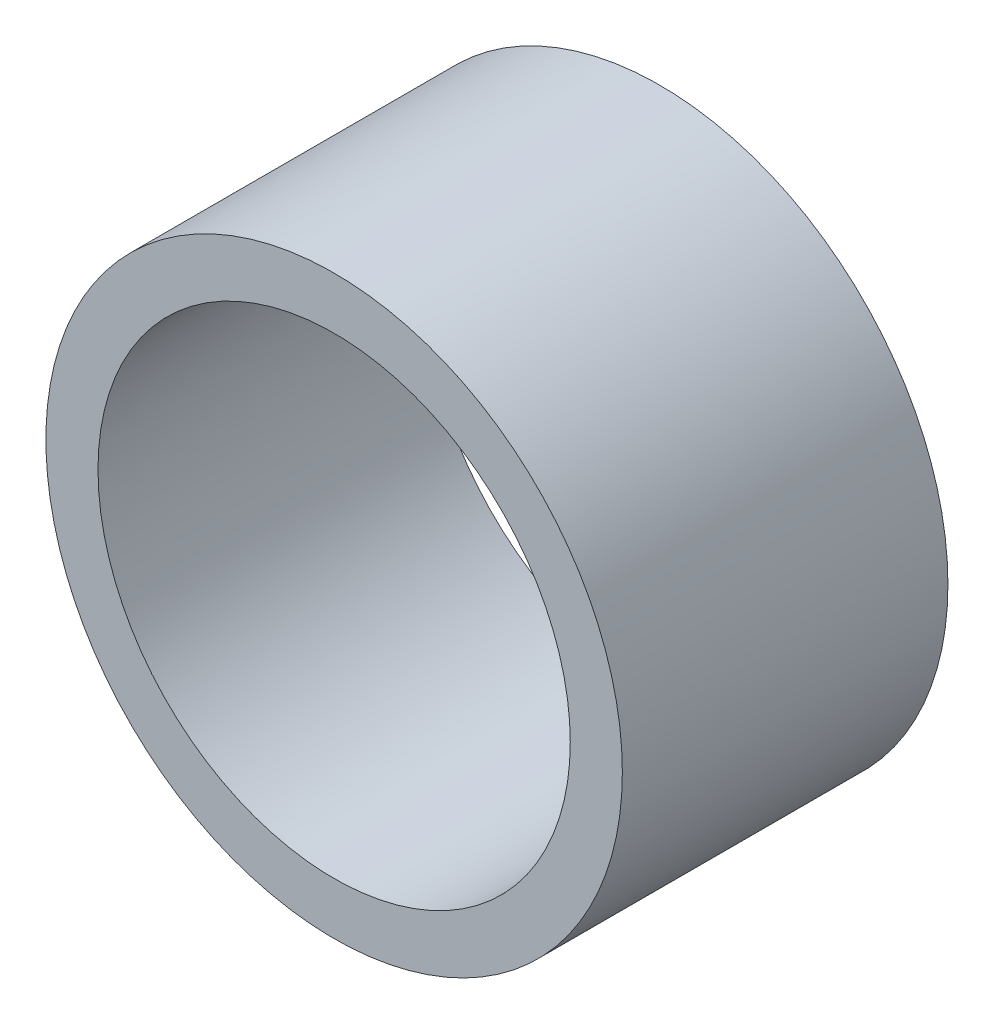
ISO-10303-21;
HEADER;
FILE_DESCRIPTION(('STEP AP214'),'2;1');
FILE_NAME('part.step','',(''),(''),'','','');
FILE_SCHEMA(('AUTOMOTIVE_DESIGN { 1 0 10303 214 1 1 1 1 }'));
ENDSEC;
DATA;
#1=APPLICATION_CONTEXT('core data for automotive mechanical design processes');
#2=APPLICATION_PROTOCOL_DEFINITION('international standard','automotive_design',2000,#1);
#3=PRODUCT_CONTEXT('',#1,'mechanical');
#4=PRODUCT('Part','Part','',(#3));
#5=PRODUCT_RELATED_PRODUCT_CATEGORY('part','',(#4));
#6=PRODUCT_DEFINITION_FORMATION('','',#4);
#7=PRODUCT_DEFINITION_CONTEXT('part definition',#1,'design');
#8=PRODUCT_DEFINITION('design','',#6,#7);
#9=PRODUCT_DEFINITION_SHAPE('','',#8);
#10=(LENGTH_UNIT() NAMED_UNIT(*) SI_UNIT(.MILLI.,.METRE.));
#11=(NAMED_UNIT(*) PLANE_ANGLE_UNIT() SI_UNIT($,.RADIAN.));
#12=(NAMED_UNIT(*) SI_UNIT($,.STERADIAN.) SOLID_ANGLE_UNIT());
#13=UNCERTAINTY_MEASURE_WITH_UNIT(LENGTH_MEASURE(1.E-05),#10,'distance_accuracy_value','');
#14=(GEOMETRIC_REPRESENTATION_CONTEXT(3) GLOBAL_UNCERTAINTY_ASSIGNED_CONTEXT((#13)) GLOBAL_UNIT_ASSIGNED_CONTEXT((#10,
#11,#12)) REPRESENTATION_CONTEXT('',''));
#15=CARTESIAN_POINT('',(0.,0.,0.));
#16=DIRECTION('',(0.,0.,1.));
#17=DIRECTION('',(1.,0.,0.));
#18=AXIS2_PLACEMENT_3D('',#15,#16,#17);
#19=CARTESIAN_POINT('',(0.,0.,23.8125));
#20=DIRECTION('',(0.,0.,-1.));
#21=DIRECTION('',(-1.,0.,0.));
#22=AXIS2_PLACEMENT_3D('',#19,#20,#21);
#23=CYLINDRICAL_SURFACE('',#22,17.272);
#24=CARTESIAN_POINT('',(0.,0.,23.8125));
#25=DIRECTION('',(0.,0.,1.));
#26=DIRECTION('',(1.,0.,0.));
#27=AXIS2_PLACEMENT_3D('',#24,#25,#26);
#28=CIRCLE('',#27,17.272);
#29=CARTESIAN_POINT('',(17.272,0.,23.8125));
#30=VERTEX_POINT('',#29);
#31=EDGE_CURVE('E42',#30,#30,#28,.T.);
#32=ORIENTED_EDGE('',*,*,#31,.T.);
#33=EDGE_LOOP('',(#32));
#34=FACE_BOUND('',#33,.T.);
#35=CARTESIAN_POINT('',(0.,0.,0.));
#36=DIRECTION('',(0.,0.,1.));
#37=DIRECTION('',(1.,0.,0.));
#38=AXIS2_PLACEMENT_3D('',#35,#36,#37);
#39=CIRCLE('',#38,17.272);
#40=CARTESIAN_POINT('',(17.272,0.,0.));
#41=VERTEX_POINT('',#40);
#42=EDGE_CURVE('E50',#41,#41,#39,.T.);
#43=ORIENTED_EDGE('',*,*,#42,.F.);
#44=EDGE_LOOP('',(#43));
#45=FACE_BOUND('',#44,.T.);
#46=ADVANCED_FACE('F34',(#34,#45),#23,.F.);
#47=CARTESIAN_POINT('',(0.,0.,23.8125));
#48=DIRECTION('',(0.,0.,-1.));
#49=DIRECTION('',(-1.,0.,0.));
#50=AXIS2_PLACEMENT_3D('',#47,#48,#49);
#51=CYLINDRICAL_SURFACE('',#50,21.082);
#52=CARTESIAN_POINT('',(0.,0.,23.8125));
#53=DIRECTION('',(0.,0.,1.));
#54=DIRECTION('',(1.,0.,0.));
#55=AXIS2_PLACEMENT_3D('',#52,#53,#54);
#56=CIRCLE('',#55,21.082);
#57=CARTESIAN_POINT('',(21.082,0.,23.8125));
#58=VERTEX_POINT('',#57);
#59=EDGE_CURVE('E10',#58,#58,#56,.T.);
#60=ORIENTED_EDGE('',*,*,#59,.F.);
#61=EDGE_LOOP('',(#60));
#62=FACE_BOUND('',#61,.T.);
#63=CARTESIAN_POINT('',(0.,0.,0.));
#64=DIRECTION('',(0.,0.,1.));
#65=DIRECTION('',(1.,0.,0.));
#66=AXIS2_PLACEMENT_3D('',#63,#64,#65);
#67=CIRCLE('',#66,21.082);
#68=CARTESIAN_POINT('',(21.082,0.,0.));
#69=VERTEX_POINT('',#68);
#70=EDGE_CURVE('E37',#69,#69,#67,.T.);
#71=ORIENTED_EDGE('',*,*,#70,.T.);
#72=EDGE_LOOP('',(#71));
#73=FACE_BOUND('',#72,.T.);
#74=ADVANCED_FACE('F61',(#62,#73),#51,.T.);
#75=CARTESIAN_POINT('',(0.,0.,23.8125));
#76=DIRECTION('',(0.,0.,1.));
#77=DIRECTION('',(1.,0.,0.));
#78=AXIS2_PLACEMENT_3D('',#75,#76,#77);
#79=PLANE('',#78);
#80=ORIENTED_EDGE('',*,*,#31,.F.);
#81=EDGE_LOOP('',(#80));
#82=FACE_BOUND('',#81,.T.);
#83=ORIENTED_EDGE('',*,*,#59,.T.);
#84=EDGE_LOOP('',(#83));
#85=FACE_BOUND('',#84,.T.);
#86=ADVANCED_FACE('F65',(#82,#85),#79,.T.);
#87=CARTESIAN_POINT('',(0.,0.,0.));
#88=DIRECTION('',(0.,0.,1.));
#89=DIRECTION('',(1.,0.,0.));
#90=AXIS2_PLACEMENT_3D('',#87,#88,#89);
#91=PLANE('',#90);
#92=ORIENTED_EDGE('',*,*,#42,.T.);
#93=EDGE_LOOP('',(#92));
#94=FACE_BOUND('',#93,.T.);
#95=ORIENTED_EDGE('',*,*,#70,.F.);
#96=EDGE_LOOP('',(#95));
#97=FACE_BOUND('',#96,.T.);
#98=ADVANCED_FACE('F63',(#94,#97),#91,.F.);
#99=CLOSED_SHELL('',(#46,#74,#86,#98));
#100=MANIFOLD_SOLID_BREP('B2',#99);
#101=ADVANCED_BREP_SHAPE_REPRESENTATION('',(#18,#100),#14);
#102=SHAPE_DEFINITION_REPRESENTATION(#9,#101);
ENDSEC;
END-ISO-10303-21;
